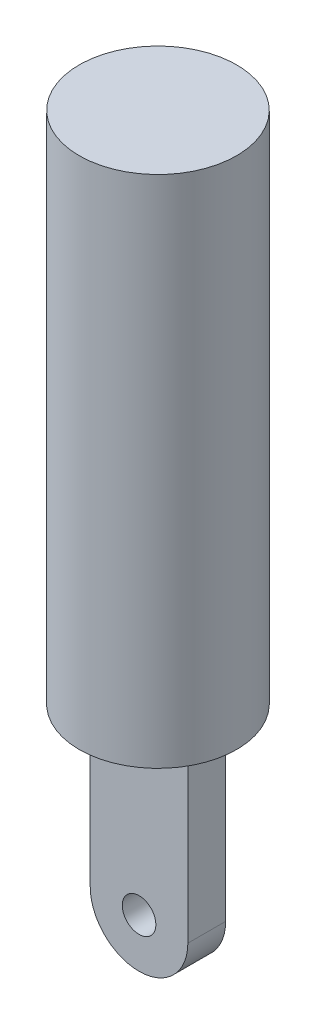
ISO-10303-21;
HEADER;
FILE_DESCRIPTION(('STEP AP214'),'2;1');
FILE_NAME('part.step','',(''),(''),'','','');
FILE_SCHEMA(('AUTOMOTIVE_DESIGN { 1 0 10303 214 1 1 1 1 }'));
ENDSEC;
DATA;
#1=APPLICATION_CONTEXT('core data for automotive mechanical design processes');
#2=APPLICATION_PROTOCOL_DEFINITION('international standard','automotive_design',2000,#1);
#3=PRODUCT_CONTEXT('',#1,'mechanical');
#4=PRODUCT('Part','Part','',(#3));
#5=PRODUCT_RELATED_PRODUCT_CATEGORY('part','',(#4));
#6=PRODUCT_DEFINITION_FORMATION('','',#4);
#7=PRODUCT_DEFINITION_CONTEXT('part definition',#1,'design');
#8=PRODUCT_DEFINITION('design','',#6,#7);
#9=PRODUCT_DEFINITION_SHAPE('','',#8);
#10=(LENGTH_UNIT() NAMED_UNIT(*) SI_UNIT(.MILLI.,.METRE.));
#11=(NAMED_UNIT(*) PLANE_ANGLE_UNIT() SI_UNIT($,.RADIAN.));
#12=(NAMED_UNIT(*) SI_UNIT($,.STERADIAN.) SOLID_ANGLE_UNIT());
#13=UNCERTAINTY_MEASURE_WITH_UNIT(LENGTH_MEASURE(1.E-05),#10,'distance_accuracy_value','');
#14=(GEOMETRIC_REPRESENTATION_CONTEXT(3) GLOBAL_UNCERTAINTY_ASSIGNED_CONTEXT((#13)) GLOBAL_UNIT_ASSIGNED_CONTEXT((#10,
#11,#12)) REPRESENTATION_CONTEXT('',''));
#15=CARTESIAN_POINT('',(0.,0.,0.));
#16=DIRECTION('',(0.,0.,1.));
#17=DIRECTION('',(1.,0.,0.));
#18=AXIS2_PLACEMENT_3D('',#15,#16,#17);
#19=CARTESIAN_POINT('',(0.,-26.,0.));
#20=DIRECTION('',(0.,1.,0.));
#21=DIRECTION('',(0.,0.,1.));
#22=AXIS2_PLACEMENT_3D('',#19,#20,#21);
#23=CYLINDRICAL_SURFACE('',#22,7.5);
#24=CARTESIAN_POINT('',(0.,0.,0.));
#25=DIRECTION('',(0.,1.,0.));
#26=DIRECTION('',(0.,0.,1.));
#27=AXIS2_PLACEMENT_3D('',#24,#25,#26);
#28=CIRCLE('',#27,7.5);
#29=CARTESIAN_POINT('',(0.,0.,7.5));
#30=VERTEX_POINT('',#29);
#31=EDGE_CURVE('E101',#30,#30,#28,.F.);
#32=ORIENTED_EDGE('',*,*,#31,.F.);
#33=EDGE_LOOP('',(#32));
#34=FACE_BOUND('',#33,.T.);
#35=CARTESIAN_POINT('',(0.,49.,0.));
#36=DIRECTION('',(0.,1.,0.));
#37=DIRECTION('',(0.,0.,1.));
#38=AXIS2_PLACEMENT_3D('',#35,#36,#37);
#39=CIRCLE('',#38,7.5);
#40=CARTESIAN_POINT('',(0.,49.,7.5));
#41=VERTEX_POINT('',#40);
#42=EDGE_CURVE('E41',#41,#41,#39,.T.);
#43=ORIENTED_EDGE('',*,*,#42,.F.);
#44=EDGE_LOOP('',(#43));
#45=FACE_BOUND('',#44,.T.);
#46=ADVANCED_FACE('F37',(#34,#45),#23,.T.);
#47=CARTESIAN_POINT('',(0.,0.,0.));
#48=DIRECTION('',(0.,1.,0.));
#49=DIRECTION('',(0.,0.,1.));
#50=AXIS2_PLACEMENT_3D('',#47,#48,#49);
#51=PLANE('',#50);
#52=DIRECTION('',(-1.,0.,0.));
#53=VECTOR('',#52,1.);
#54=CARTESIAN_POINT('',(-4.64999999999999,0.,-1.8));
#55=LINE('',#54,#53);
#56=CARTESIAN_POINT('',(4.65000000000001,0.,-1.8));
#57=VERTEX_POINT('',#56);
#58=CARTESIAN_POINT('',(-4.64999999999999,0.,-1.8));
#59=VERTEX_POINT('',#58);
#60=EDGE_CURVE('E113',#57,#59,#55,.T.);
#61=ORIENTED_EDGE('',*,*,#60,.T.);
#62=DIRECTION('',(0.,0.,1.));
#63=VECTOR('',#62,1.);
#64=CARTESIAN_POINT('',(-4.64999999999999,0.,-1.8));
#65=LINE('',#64,#63);
#66=CARTESIAN_POINT('',(-4.64999999999999,0.,1.8));
#67=VERTEX_POINT('',#66);
#68=EDGE_CURVE('E46',#59,#67,#65,.T.);
#69=ORIENTED_EDGE('',*,*,#68,.T.);
#70=DIRECTION('',(-1.,0.,0.));
#71=VECTOR('',#70,1.);
#72=CARTESIAN_POINT('',(-4.64999999999999,0.,1.8));
#73=LINE('',#72,#71);
#74=CARTESIAN_POINT('',(4.65000000000001,0.,1.8));
#75=VERTEX_POINT('',#74);
#76=EDGE_CURVE('E91',#75,#67,#73,.T.);
#77=ORIENTED_EDGE('',*,*,#76,.F.);
#78=DIRECTION('',(0.,0.,1.));
#79=VECTOR('',#78,1.);
#80=CARTESIAN_POINT('',(4.65000000000001,0.,-1.8));
#81=LINE('',#80,#79);
#82=EDGE_CURVE('E87',#57,#75,#81,.T.);
#83=ORIENTED_EDGE('',*,*,#82,.F.);
#84=EDGE_LOOP('',(#61,#69,#77,#83));
#85=FACE_BOUND('',#84,.T.);
#86=ORIENTED_EDGE('',*,*,#31,.T.);
#87=EDGE_LOOP('',(#86));
#88=FACE_BOUND('',#87,.T.);
#89=ADVANCED_FACE('F39',(#85,#88),#51,.F.);
#90=CARTESIAN_POINT('',(0.,-16.5,-1.8));
#91=DIRECTION('',(0.,0.,1.));
#92=DIRECTION('',(1.,0.,0.));
#93=AXIS2_PLACEMENT_3D('',#90,#91,#92);
#94=CYLINDRICAL_SURFACE('',#93,4.65);
#95=DIRECTION('',(0.,0.,1.));
#96=VECTOR('',#95,1.);
#97=CARTESIAN_POINT('',(4.65000000000001,-16.5,-1.8));
#98=LINE('',#97,#96);
#99=CARTESIAN_POINT('',(4.65000000000001,-16.5,-1.8));
#100=VERTEX_POINT('',#99);
#101=CARTESIAN_POINT('',(4.65000000000001,-16.5,1.8));
#102=VERTEX_POINT('',#101);
#103=EDGE_CURVE('E80',#100,#102,#98,.T.);
#104=ORIENTED_EDGE('',*,*,#103,.T.);
#105=CARTESIAN_POINT('',(0.,-16.5,1.8));
#106=DIRECTION('',(0.,0.,1.));
#107=DIRECTION('',(1.,0.,0.));
#108=AXIS2_PLACEMENT_3D('',#105,#106,#107);
#109=CIRCLE('',#108,4.65);
#110=CARTESIAN_POINT('',(-4.64999999999999,-16.5,1.8));
#111=VERTEX_POINT('',#110);
#112=EDGE_CURVE('E82',#111,#102,#109,.T.);
#113=ORIENTED_EDGE('',*,*,#112,.F.);
#114=DIRECTION('',(0.,0.,1.));
#115=VECTOR('',#114,1.);
#116=CARTESIAN_POINT('',(-4.64999999999999,-16.5,-1.8));
#117=LINE('',#116,#115);
#118=CARTESIAN_POINT('',(-4.64999999999999,-16.5,-1.8));
#119=VERTEX_POINT('',#118);
#120=EDGE_CURVE('E11',#119,#111,#117,.T.);
#121=ORIENTED_EDGE('',*,*,#120,.F.);
#122=CARTESIAN_POINT('',(0.,-16.5,-1.8));
#123=DIRECTION('',(0.,0.,1.));
#124=DIRECTION('',(1.,0.,0.));
#125=AXIS2_PLACEMENT_3D('',#122,#123,#124);
#126=CIRCLE('',#125,4.65);
#127=EDGE_CURVE('E84',#119,#100,#126,.T.);
#128=ORIENTED_EDGE('',*,*,#127,.T.);
#129=EDGE_LOOP('',(#104,#113,#121,#128));
#130=FACE_BOUND('',#129,.T.);
#131=ADVANCED_FACE('F81',(#130),#94,.T.);
#132=CARTESIAN_POINT('',(-4.64999999999999,-16.5,-1.8));
#133=DIRECTION('',(-1.,0.,0.));
#134=DIRECTION('',(0.,0.,1.));
#135=AXIS2_PLACEMENT_3D('',#132,#133,#134);
#136=PLANE('',#135);
#137=ORIENTED_EDGE('',*,*,#120,.T.);
#138=DIRECTION('',(0.,-1.,0.));
#139=VECTOR('',#138,1.);
#140=CARTESIAN_POINT('',(-4.64999999999999,-8.5,1.8));
#141=LINE('',#140,#139);
#142=EDGE_CURVE('E97',#67,#111,#141,.T.);
#143=ORIENTED_EDGE('',*,*,#142,.F.);
#144=ORIENTED_EDGE('',*,*,#68,.F.);
#145=DIRECTION('',(0.,-1.,0.));
#146=VECTOR('',#145,1.);
#147=CARTESIAN_POINT('',(-4.64999999999999,-8.5,-1.8));
#148=LINE('',#147,#146);
#149=EDGE_CURVE('E61',#59,#119,#148,.T.);
#150=ORIENTED_EDGE('',*,*,#149,.T.);
#151=EDGE_LOOP('',(#137,#143,#144,#150));
#152=FACE_BOUND('',#151,.T.);
#153=ADVANCED_FACE('F122',(#152),#136,.T.);
#154=CARTESIAN_POINT('',(4.65000000000001,0.,-1.8));
#155=DIRECTION('',(1.,0.,0.));
#156=DIRECTION('',(0.,1.,0.));
#157=AXIS2_PLACEMENT_3D('',#154,#155,#156);
#158=PLANE('',#157);
#159=ORIENTED_EDGE('',*,*,#82,.T.);
#160=DIRECTION('',(0.,1.,0.));
#161=VECTOR('',#160,1.);
#162=CARTESIAN_POINT('',(4.65000000000001,-8.5,1.8));
#163=LINE('',#162,#161);
#164=EDGE_CURVE('E54',#102,#75,#163,.T.);
#165=ORIENTED_EDGE('',*,*,#164,.F.);
#166=ORIENTED_EDGE('',*,*,#103,.F.);
#167=DIRECTION('',(0.,1.,0.));
#168=VECTOR('',#167,1.);
#169=CARTESIAN_POINT('',(4.65000000000001,-8.5,-1.8));
#170=LINE('',#169,#168);
#171=EDGE_CURVE('E111',#100,#57,#170,.T.);
#172=ORIENTED_EDGE('',*,*,#171,.T.);
#173=EDGE_LOOP('',(#159,#165,#166,#172));
#174=FACE_BOUND('',#173,.T.);
#175=ADVANCED_FACE('F88',(#174),#158,.T.);
#176=CARTESIAN_POINT('',(0.,-16.5,-1.8));
#177=DIRECTION('',(0.,0.,1.));
#178=DIRECTION('',(1.,0.,0.));
#179=AXIS2_PLACEMENT_3D('',#176,#177,#178);
#180=PLANE('',#179);
#181=CARTESIAN_POINT('',(0.,-16.5,-1.8));
#182=DIRECTION('',(0.,0.,1.));
#183=DIRECTION('',(1.,0.,0.));
#184=AXIS2_PLACEMENT_3D('',#181,#182,#183);
#185=CIRCLE('',#184,1.6);
#186=CARTESIAN_POINT('',(1.60000000000001,-16.5,-1.8));
#187=VERTEX_POINT('',#186);
#188=EDGE_CURVE('E107',#187,#187,#185,.T.);
#189=ORIENTED_EDGE('',*,*,#188,.T.);
#190=EDGE_LOOP('',(#189));
#191=FACE_BOUND('',#190,.T.);
#192=ORIENTED_EDGE('',*,*,#127,.F.);
#193=ORIENTED_EDGE('',*,*,#149,.F.);
#194=ORIENTED_EDGE('',*,*,#60,.F.);
#195=ORIENTED_EDGE('',*,*,#171,.F.);
#196=EDGE_LOOP('',(#192,#193,#194,#195));
#197=FACE_BOUND('',#196,.T.);
#198=ADVANCED_FACE('F124',(#191,#197),#180,.F.);
#199=CARTESIAN_POINT('',(0.,-16.5,-1.8));
#200=DIRECTION('',(0.,0.,1.));
#201=DIRECTION('',(1.,0.,0.));
#202=AXIS2_PLACEMENT_3D('',#199,#200,#201);
#203=CYLINDRICAL_SURFACE('',#202,1.6);
#204=ORIENTED_EDGE('',*,*,#188,.F.);
#205=EDGE_LOOP('',(#204));
#206=FACE_BOUND('',#205,.T.);
#207=CARTESIAN_POINT('',(0.,-16.5,1.8));
#208=DIRECTION('',(0.,0.,1.));
#209=DIRECTION('',(1.,0.,0.));
#210=AXIS2_PLACEMENT_3D('',#207,#208,#209);
#211=CIRCLE('',#210,1.6);
#212=CARTESIAN_POINT('',(1.60000000000001,-16.5,1.8));
#213=VERTEX_POINT('',#212);
#214=EDGE_CURVE('E98',#213,#213,#211,.T.);
#215=ORIENTED_EDGE('',*,*,#214,.T.);
#216=EDGE_LOOP('',(#215));
#217=FACE_BOUND('',#216,.T.);
#218=ADVANCED_FACE('F126',(#206,#217),#203,.F.);
#219=CARTESIAN_POINT('',(0.,-16.5,1.8));
#220=DIRECTION('',(0.,0.,1.));
#221=DIRECTION('',(1.,0.,0.));
#222=AXIS2_PLACEMENT_3D('',#219,#220,#221);
#223=PLANE('',#222);
#224=ORIENTED_EDGE('',*,*,#112,.T.);
#225=ORIENTED_EDGE('',*,*,#164,.T.);
#226=ORIENTED_EDGE('',*,*,#76,.T.);
#227=ORIENTED_EDGE('',*,*,#142,.T.);
#228=EDGE_LOOP('',(#224,#225,#226,#227));
#229=FACE_BOUND('',#228,.T.);
#230=ORIENTED_EDGE('',*,*,#214,.F.);
#231=EDGE_LOOP('',(#230));
#232=FACE_BOUND('',#231,.T.);
#233=ADVANCED_FACE('F94',(#229,#232),#223,.T.);
#234=CARTESIAN_POINT('',(0.,49.,0.));
#235=DIRECTION('',(0.,1.,0.));
#236=DIRECTION('',(0.,0.,1.));
#237=AXIS2_PLACEMENT_3D('',#234,#235,#236);
#238=PLANE('',#237);
#239=ORIENTED_EDGE('',*,*,#42,.T.);
#240=EDGE_LOOP('',(#239));
#241=FACE_BOUND('',#240,.T.);
#242=ADVANCED_FACE('F149',(#241),#238,.T.);
#243=CLOSED_SHELL('',(#46,#89,#131,#153,#175,#198,#218,#233,#242));
#244=MANIFOLD_SOLID_BREP('B2',#243);
#245=ADVANCED_BREP_SHAPE_REPRESENTATION('',(#18,#244),#14);
#246=SHAPE_DEFINITION_REPRESENTATION(#9,#245);
ENDSEC;
END-ISO-10303-21;
